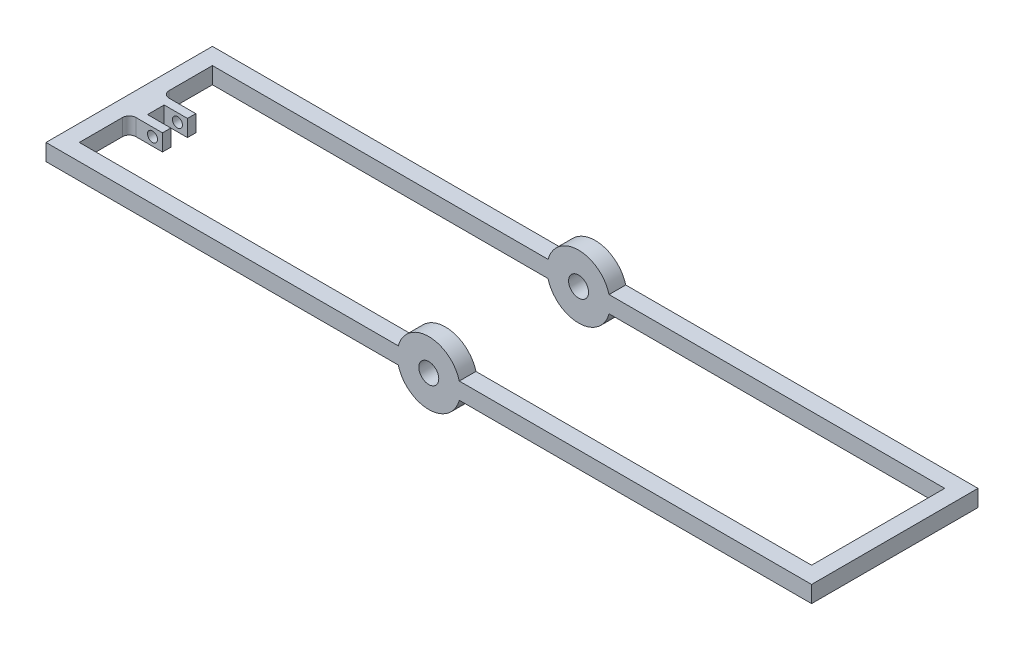
ISO-10303-21;
HEADER;
FILE_DESCRIPTION(('STEP AP214'),'2;1');
FILE_NAME('part.step','',(''),(''),'','','');
FILE_SCHEMA(('AUTOMOTIVE_DESIGN { 1 0 10303 214 1 1 1 1 }'));
ENDSEC;
DATA;
#1=APPLICATION_CONTEXT('core data for automotive mechanical design processes');
#2=APPLICATION_PROTOCOL_DEFINITION('international standard','automotive_design',2000,#1);
#3=PRODUCT_CONTEXT('',#1,'mechanical');
#4=PRODUCT('Part','Part','',(#3));
#5=PRODUCT_RELATED_PRODUCT_CATEGORY('part','',(#4));
#6=PRODUCT_DEFINITION_FORMATION('','',#4);
#7=PRODUCT_DEFINITION_CONTEXT('part definition',#1,'design');
#8=PRODUCT_DEFINITION('design','',#6,#7);
#9=PRODUCT_DEFINITION_SHAPE('','',#8);
#10=(LENGTH_UNIT() NAMED_UNIT(*) SI_UNIT(.MILLI.,.METRE.));
#11=(NAMED_UNIT(*) PLANE_ANGLE_UNIT() SI_UNIT($,.RADIAN.));
#12=(NAMED_UNIT(*) SI_UNIT($,.STERADIAN.) SOLID_ANGLE_UNIT());
#13=UNCERTAINTY_MEASURE_WITH_UNIT(LENGTH_MEASURE(1.E-05),#10,'distance_accuracy_value','');
#14=(GEOMETRIC_REPRESENTATION_CONTEXT(3) GLOBAL_UNCERTAINTY_ASSIGNED_CONTEXT((#13)) GLOBAL_UNIT_ASSIGNED_CONTEXT((#10,
#11,#12)) REPRESENTATION_CONTEXT('',''));
#15=CARTESIAN_POINT('',(0.,0.,0.));
#16=DIRECTION('',(0.,0.,1.));
#17=DIRECTION('',(1.,0.,0.));
#18=AXIS2_PLACEMENT_3D('',#15,#16,#17);
#19=CARTESIAN_POINT('',(15.,0.,0.));
#20=DIRECTION('',(-1.,0.,0.));
#21=DIRECTION('',(0.,0.,1.));
#22=AXIS2_PLACEMENT_3D('',#19,#20,#21);
#23=PLANE('',#22);
#24=DIRECTION('',(0.,0.,-1.));
#25=VECTOR('',#24,1.);
#26=CARTESIAN_POINT('',(15.,0.,20.));
#27=LINE('',#26,#25);
#28=CARTESIAN_POINT('',(15.,0.,30.));
#29=VERTEX_POINT('',#28);
#30=CARTESIAN_POINT('',(15.,0.,27.5));
#31=VERTEX_POINT('',#30);
#32=EDGE_CURVE('E552',#29,#31,#27,.T.);
#33=ORIENTED_EDGE('',*,*,#32,.T.);
#34=DIRECTION('',(0.,1.,0.));
#35=VECTOR('',#34,1.);
#36=CARTESIAN_POINT('',(15.,-7.001,27.5));
#37=LINE('',#36,#35);
#38=CARTESIAN_POINT('',(15.,5.,27.5));
#39=VERTEX_POINT('',#38);
#40=EDGE_CURVE('E561',#31,#39,#37,.T.);
#41=ORIENTED_EDGE('',*,*,#40,.T.);
#42=DIRECTION('',(0.,0.,1.));
#43=VECTOR('',#42,1.);
#44=CARTESIAN_POINT('',(15.,5.,20.));
#45=LINE('',#44,#43);
#46=CARTESIAN_POINT('',(15.,5.,30.));
#47=VERTEX_POINT('',#46);
#48=EDGE_CURVE('E243',#39,#47,#45,.T.);
#49=ORIENTED_EDGE('',*,*,#48,.T.);
#50=DIRECTION('',(0.,-1.,0.));
#51=VECTOR('',#50,1.);
#52=CARTESIAN_POINT('',(15.,5.,30.));
#53=LINE('',#52,#51);
#54=EDGE_CURVE('E553',#47,#29,#53,.T.);
#55=ORIENTED_EDGE('',*,*,#54,.T.);
#56=EDGE_LOOP('',(#33,#41,#49,#55));
#57=FACE_BOUND('',#56,.T.);
#58=ADVANCED_FACE('F40',(#57),#23,.F.);
#59=CARTESIAN_POINT('',(5.,12.,45.));
#60=DIRECTION('',(-1.,0.,0.));
#61=DIRECTION('',(0.,0.,1.));
#62=AXIS2_PLACEMENT_3D('',#59,#60,#61);
#63=PLANE('',#62);
#64=DIRECTION('',(0.,0.,1.));
#65=VECTOR('',#64,1.);
#66=CARTESIAN_POINT('',(5.,0.,50.));
#67=LINE('',#66,#65);
#68=CARTESIAN_POINT('',(5.,0.,32.));
#69=VERTEX_POINT('',#68);
#70=CARTESIAN_POINT('',(5.,0.,45.));
#71=VERTEX_POINT('',#70);
#72=EDGE_CURVE('E325',#69,#71,#67,.T.);
#73=ORIENTED_EDGE('',*,*,#72,.F.);
#74=DIRECTION('',(0.,-1.,0.));
#75=VECTOR('',#74,1.);
#76=CARTESIAN_POINT('',(5.,5.,32.));
#77=LINE('',#76,#75);
#78=CARTESIAN_POINT('',(5.,5.,32.));
#79=VERTEX_POINT('',#78);
#80=EDGE_CURVE('E450',#69,#79,#77,.F.);
#81=ORIENTED_EDGE('',*,*,#80,.T.);
#82=DIRECTION('',(0.,0.,-1.));
#83=VECTOR('',#82,1.);
#84=CARTESIAN_POINT('',(5.,5.,50.));
#85=LINE('',#84,#83);
#86=CARTESIAN_POINT('',(5.,5.,45.));
#87=VERTEX_POINT('',#86);
#88=EDGE_CURVE('E438',#87,#79,#85,.T.);
#89=ORIENTED_EDGE('',*,*,#88,.F.);
#90=DIRECTION('',(0.,-1.,0.));
#91=VECTOR('',#90,1.);
#92=CARTESIAN_POINT('',(5.,12.,45.));
#93=LINE('',#92,#91);
#94=EDGE_CURVE('E273',#87,#71,#93,.T.);
#95=ORIENTED_EDGE('',*,*,#94,.T.);
#96=EDGE_LOOP('',(#73,#81,#89,#95));
#97=FACE_BOUND('',#96,.T.);
#98=ADVANCED_FACE('F485',(#97),#63,.F.);
#99=CARTESIAN_POINT('',(5.,5.,18.));
#100=VERTEX_POINT('',#99);
#101=CARTESIAN_POINT('',(5.,5.,4.99999999999999));
#102=VERTEX_POINT('',#101);
#103=EDGE_CURVE('E431',#100,#102,#85,.T.);
#104=ORIENTED_EDGE('',*,*,#103,.F.);
#105=DIRECTION('',(0.,1.,0.));
#106=VECTOR('',#105,1.);
#107=CARTESIAN_POINT('',(5.,0.,18.));
#108=LINE('',#107,#106);
#109=CARTESIAN_POINT('',(5.,0.,18.));
#110=VERTEX_POINT('',#109);
#111=EDGE_CURVE('E63',#100,#110,#108,.F.);
#112=ORIENTED_EDGE('',*,*,#111,.T.);
#113=CARTESIAN_POINT('',(5.,0.,4.99999999999999));
#114=VERTEX_POINT('',#113);
#115=EDGE_CURVE('E326',#114,#110,#67,.T.);
#116=ORIENTED_EDGE('',*,*,#115,.F.);
#117=DIRECTION('',(0.,-1.,0.));
#118=VECTOR('',#117,1.);
#119=CARTESIAN_POINT('',(5.,12.,4.99999999999999));
#120=LINE('',#119,#118);
#121=EDGE_CURVE('E269',#102,#114,#120,.T.);
#122=ORIENTED_EDGE('',*,*,#121,.F.);
#123=EDGE_LOOP('',(#104,#112,#116,#122));
#124=FACE_BOUND('',#123,.T.);
#125=ADVANCED_FACE('F543',(#124),#63,.F.);
#126=CARTESIAN_POINT('',(115.,2.5,50.));
#127=DIRECTION('',(0.,0.,-1.));
#128=DIRECTION('',(-1.,0.,0.));
#129=AXIS2_PLACEMENT_3D('',#126,#127,#128);
#130=CYLINDRICAL_SURFACE('',#129,9.5);
#131=DIRECTION('',(0.,0.,-1.));
#132=VECTOR('',#131,1.);
#133=CARTESIAN_POINT('',(105.834848610088,0.,50.));
#134=LINE('',#133,#132);
#135=CARTESIAN_POINT('',(105.834848610088,0.,50.));
#136=VERTEX_POINT('',#135);
#137=CARTESIAN_POINT('',(105.834848610088,0.,45.));
#138=VERTEX_POINT('',#137);
#139=EDGE_CURVE('E423',#136,#138,#134,.T.);
#140=ORIENTED_EDGE('',*,*,#139,.T.);
#141=CARTESIAN_POINT('',(115.,2.5,45.));
#142=DIRECTION('',(0.,0.,1.));
#143=DIRECTION('',(1.,0.,0.));
#144=AXIS2_PLACEMENT_3D('',#141,#142,#143);
#145=CIRCLE('',#144,9.5);
#146=CARTESIAN_POINT('',(124.165151389912,0.,45.));
#147=VERTEX_POINT('',#146);
#148=EDGE_CURVE('E294',#138,#147,#145,.T.);
#149=ORIENTED_EDGE('',*,*,#148,.T.);
#150=DIRECTION('',(0.,0.,-1.));
#151=VECTOR('',#150,1.);
#152=CARTESIAN_POINT('',(124.165151389912,0.,50.));
#153=LINE('',#152,#151);
#154=CARTESIAN_POINT('',(124.165151389912,0.,50.));
#155=VERTEX_POINT('',#154);
#156=EDGE_CURVE('E418',#155,#147,#153,.T.);
#157=ORIENTED_EDGE('',*,*,#156,.F.);
#158=CARTESIAN_POINT('',(115.,2.5,50.));
#159=DIRECTION('',(0.,0.,1.));
#160=DIRECTION('',(1.,0.,0.));
#161=AXIS2_PLACEMENT_3D('',#158,#159,#160);
#162=CIRCLE('',#161,9.5);
#163=EDGE_CURVE('E350',#136,#155,#162,.T.);
#164=ORIENTED_EDGE('',*,*,#163,.F.);
#165=EDGE_LOOP('',(#140,#149,#157,#164));
#166=FACE_BOUND('',#165,.T.);
#167=ADVANCED_FACE('F533',(#166),#130,.T.);
#168=CARTESIAN_POINT('',(115.,2.5,50.));
#169=DIRECTION('',(0.,0.,-1.));
#170=DIRECTION('',(-1.,0.,0.));
#171=AXIS2_PLACEMENT_3D('',#168,#169,#170);
#172=CYLINDRICAL_SURFACE('',#171,9.5);
#173=CARTESIAN_POINT('',(115.,2.5,45.));
#174=DIRECTION('',(0.,0.,1.));
#175=DIRECTION('',(1.,0.,0.));
#176=AXIS2_PLACEMENT_3D('',#173,#174,#175);
#177=CIRCLE('',#176,9.5);
#178=CARTESIAN_POINT('',(124.165151389912,5.,45.));
#179=VERTEX_POINT('',#178);
#180=CARTESIAN_POINT('',(105.834848610088,5.,45.));
#181=VERTEX_POINT('',#180);
#182=EDGE_CURVE('E283',#179,#181,#177,.T.);
#183=ORIENTED_EDGE('',*,*,#182,.T.);
#184=DIRECTION('',(0.,0.,-1.));
#185=VECTOR('',#184,1.);
#186=CARTESIAN_POINT('',(105.834848610088,5.,50.));
#187=LINE('',#186,#185);
#188=CARTESIAN_POINT('',(105.834848610088,5.,50.));
#189=VERTEX_POINT('',#188);
#190=EDGE_CURVE('E400',#189,#181,#187,.T.);
#191=ORIENTED_EDGE('',*,*,#190,.F.);
#192=CARTESIAN_POINT('',(115.,2.5,50.));
#193=DIRECTION('',(0.,0.,1.));
#194=DIRECTION('',(1.,0.,0.));
#195=AXIS2_PLACEMENT_3D('',#192,#193,#194);
#196=CIRCLE('',#195,9.5);
#197=CARTESIAN_POINT('',(124.165151389912,5.,50.));
#198=VERTEX_POINT('',#197);
#199=EDGE_CURVE('E362',#198,#189,#196,.T.);
#200=ORIENTED_EDGE('',*,*,#199,.F.);
#201=DIRECTION('',(0.,0.,-1.));
#202=VECTOR('',#201,1.);
#203=CARTESIAN_POINT('',(124.165151389912,5.,50.));
#204=LINE('',#203,#202);
#205=EDGE_CURVE('E405',#198,#179,#204,.T.);
#206=ORIENTED_EDGE('',*,*,#205,.T.);
#207=EDGE_LOOP('',(#183,#191,#200,#206));
#208=FACE_BOUND('',#207,.T.);
#209=ADVANCED_FACE('F497',(#208),#172,.T.);
#210=CARTESIAN_POINT('',(115.,2.5,50.));
#211=DIRECTION('',(0.,0.,-1.));
#212=DIRECTION('',(-1.,0.,0.));
#213=AXIS2_PLACEMENT_3D('',#210,#211,#212);
#214=CYLINDRICAL_SURFACE('',#213,2.99999999999998);
#215=CARTESIAN_POINT('',(115.,2.5,5.00000000000001));
#216=DIRECTION('',(0.,0.,-1.));
#217=DIRECTION('',(-1.,0.,0.));
#218=AXIS2_PLACEMENT_3D('',#215,#216,#217);
#219=CIRCLE('',#218,2.99999999999998);
#220=CARTESIAN_POINT('',(112.,2.5,5.00000000000001));
#221=VERTEX_POINT('',#220);
#222=EDGE_CURVE('E301',#221,#221,#219,.T.);
#223=ORIENTED_EDGE('',*,*,#222,.F.);
#224=EDGE_LOOP('',(#223));
#225=FACE_BOUND('',#224,.T.);
#226=CARTESIAN_POINT('',(115.,2.5,0.));
#227=DIRECTION('',(0.,0.,1.));
#228=DIRECTION('',(1.,0.,0.));
#229=AXIS2_PLACEMENT_3D('',#226,#227,#228);
#230=CIRCLE('',#229,2.99999999999998);
#231=CARTESIAN_POINT('',(118.,2.5,0.));
#232=VERTEX_POINT('',#231);
#233=EDGE_CURVE('E333',#232,#232,#230,.T.);
#234=ORIENTED_EDGE('',*,*,#233,.F.);
#235=EDGE_LOOP('',(#234));
#236=FACE_BOUND('',#235,.T.);
#237=ADVANCED_FACE('F651',(#225,#236),#214,.F.);
#238=CARTESIAN_POINT('',(115.,2.5,50.));
#239=DIRECTION('',(0.,0.,1.));
#240=DIRECTION('',(1.,0.,0.));
#241=AXIS2_PLACEMENT_3D('',#238,#239,#240);
#242=PLANE('',#241);
#243=DIRECTION('',(0.,-1.,0.));
#244=VECTOR('',#243,1.);
#245=CARTESIAN_POINT('',(0.,0.,50.));
#246=LINE('',#245,#244);
#247=CARTESIAN_POINT('',(0.,5.,50.));
#248=VERTEX_POINT('',#247);
#249=CARTESIAN_POINT('',(0.,0.,50.));
#250=VERTEX_POINT('',#249);
#251=EDGE_CURVE('E342',#248,#250,#246,.T.);
#252=ORIENTED_EDGE('',*,*,#251,.T.);
#253=DIRECTION('',(1.,0.,0.));
#254=VECTOR('',#253,1.);
#255=CARTESIAN_POINT('',(0.,0.,50.));
#256=LINE('',#255,#254);
#257=EDGE_CURVE('E346',#250,#136,#256,.T.);
#258=ORIENTED_EDGE('',*,*,#257,.T.);
#259=ORIENTED_EDGE('',*,*,#163,.T.);
#260=DIRECTION('',(1.,0.,0.));
#261=VECTOR('',#260,1.);
#262=CARTESIAN_POINT('',(124.165151389912,0.,50.));
#263=LINE('',#262,#261);
#264=CARTESIAN_POINT('',(230.,0.,50.));
#265=VERTEX_POINT('',#264);
#266=EDGE_CURVE('E353',#155,#265,#263,.T.);
#267=ORIENTED_EDGE('',*,*,#266,.T.);
#268=DIRECTION('',(0.,1.,0.));
#269=VECTOR('',#268,1.);
#270=CARTESIAN_POINT('',(230.,0.,50.));
#271=LINE('',#270,#269);
#272=CARTESIAN_POINT('',(230.,5.,50.));
#273=VERTEX_POINT('',#272);
#274=EDGE_CURVE('E356',#265,#273,#271,.T.);
#275=ORIENTED_EDGE('',*,*,#274,.T.);
#276=DIRECTION('',(-1.,0.,0.));
#277=VECTOR('',#276,1.);
#278=CARTESIAN_POINT('',(124.165151389912,5.,50.));
#279=LINE('',#278,#277);
#280=EDGE_CURVE('E359',#273,#198,#279,.T.);
#281=ORIENTED_EDGE('',*,*,#280,.T.);
#282=ORIENTED_EDGE('',*,*,#199,.T.);
#283=DIRECTION('',(-1.,0.,0.));
#284=VECTOR('',#283,1.);
#285=CARTESIAN_POINT('',(0.,5.,50.));
#286=LINE('',#285,#284);
#287=EDGE_CURVE('E365',#189,#248,#286,.T.);
#288=ORIENTED_EDGE('',*,*,#287,.T.);
#289=EDGE_LOOP('',(#252,#258,#259,#267,#275,#281,#282,#288));
#290=FACE_BOUND('',#289,.T.);
#291=CARTESIAN_POINT('',(115.,2.5,50.));
#292=DIRECTION('',(0.,0.,1.));
#293=DIRECTION('',(1.,0.,0.));
#294=AXIS2_PLACEMENT_3D('',#291,#292,#293);
#295=CIRCLE('',#294,2.99999999999998);
#296=CARTESIAN_POINT('',(118.,2.5,50.));
#297=VERTEX_POINT('',#296);
#298=EDGE_CURVE('E334',#297,#297,#295,.T.);
#299=ORIENTED_EDGE('',*,*,#298,.F.);
#300=EDGE_LOOP('',(#299));
#301=FACE_BOUND('',#300,.T.);
#302=ADVANCED_FACE('F499',(#290,#301),#242,.T.);
#303=CARTESIAN_POINT('',(115.,2.5,0.));
#304=DIRECTION('',(0.,0.,1.));
#305=DIRECTION('',(1.,0.,0.));
#306=AXIS2_PLACEMENT_3D('',#303,#304,#305);
#307=PLANE('',#306);
#308=DIRECTION('',(0.,-1.,0.));
#309=VECTOR('',#308,1.);
#310=CARTESIAN_POINT('',(0.,0.,0.));
#311=LINE('',#310,#309);
#312=CARTESIAN_POINT('',(0.,5.,0.));
#313=VERTEX_POINT('',#312);
#314=CARTESIAN_POINT('',(0.,0.,0.));
#315=VERTEX_POINT('',#314);
#316=EDGE_CURVE('E338',#313,#315,#311,.T.);
#317=ORIENTED_EDGE('',*,*,#316,.F.);
#318=DIRECTION('',(-1.,0.,0.));
#319=VECTOR('',#318,1.);
#320=CARTESIAN_POINT('',(0.,5.,0.));
#321=LINE('',#320,#319);
#322=CARTESIAN_POINT('',(105.834848610088,5.,0.));
#323=VERTEX_POINT('',#322);
#324=EDGE_CURVE('E347',#323,#313,#321,.T.);
#325=ORIENTED_EDGE('',*,*,#324,.F.);
#326=CARTESIAN_POINT('',(115.,2.5,0.));
#327=DIRECTION('',(0.,0.,1.));
#328=DIRECTION('',(1.,0.,0.));
#329=AXIS2_PLACEMENT_3D('',#326,#327,#328);
#330=CIRCLE('',#329,9.5);
#331=CARTESIAN_POINT('',(124.165151389912,5.,0.));
#332=VERTEX_POINT('',#331);
#333=EDGE_CURVE('E390',#332,#323,#330,.T.);
#334=ORIENTED_EDGE('',*,*,#333,.F.);
#335=DIRECTION('',(-1.,0.,0.));
#336=VECTOR('',#335,1.);
#337=CARTESIAN_POINT('',(124.165151389912,5.,0.));
#338=LINE('',#337,#336);
#339=CARTESIAN_POINT('',(230.,5.,0.));
#340=VERTEX_POINT('',#339);
#341=EDGE_CURVE('E386',#340,#332,#338,.T.);
#342=ORIENTED_EDGE('',*,*,#341,.F.);
#343=DIRECTION('',(0.,1.,0.));
#344=VECTOR('',#343,1.);
#345=CARTESIAN_POINT('',(230.,0.,0.));
#346=LINE('',#345,#344);
#347=CARTESIAN_POINT('',(230.,0.,0.));
#348=VERTEX_POINT('',#347);
#349=EDGE_CURVE('E383',#348,#340,#346,.T.);
#350=ORIENTED_EDGE('',*,*,#349,.F.);
#351=DIRECTION('',(1.,0.,0.));
#352=VECTOR('',#351,1.);
#353=CARTESIAN_POINT('',(124.165151389912,0.,0.));
#354=LINE('',#353,#352);
#355=CARTESIAN_POINT('',(124.165151389912,0.,0.));
#356=VERTEX_POINT('',#355);
#357=EDGE_CURVE('E380',#356,#348,#354,.T.);
#358=ORIENTED_EDGE('',*,*,#357,.F.);
#359=CARTESIAN_POINT('',(115.,2.5,0.));
#360=DIRECTION('',(0.,0.,1.));
#361=DIRECTION('',(1.,0.,0.));
#362=AXIS2_PLACEMENT_3D('',#359,#360,#361);
#363=CIRCLE('',#362,9.5);
#364=CARTESIAN_POINT('',(105.834848610088,0.,0.));
#365=VERTEX_POINT('',#364);
#366=EDGE_CURVE('E376',#365,#356,#363,.T.);
#367=ORIENTED_EDGE('',*,*,#366,.F.);
#368=DIRECTION('',(1.,0.,0.));
#369=VECTOR('',#368,1.);
#370=CARTESIAN_POINT('',(0.,0.,0.));
#371=LINE('',#370,#369);
#372=EDGE_CURVE('E372',#315,#365,#371,.T.);
#373=ORIENTED_EDGE('',*,*,#372,.F.);
#374=EDGE_LOOP('',(#317,#325,#334,#342,#350,#358,#367,#373));
#375=FACE_BOUND('',#374,.T.);
#376=ORIENTED_EDGE('',*,*,#233,.T.);
#377=EDGE_LOOP('',(#376));
#378=FACE_BOUND('',#377,.T.);
#379=ADVANCED_FACE('F510',(#375,#378),#307,.F.);
#380=CARTESIAN_POINT('',(0.,0.,50.));
#381=DIRECTION('',(1.,0.,0.));
#382=DIRECTION('',(0.,0.,-1.));
#383=AXIS2_PLACEMENT_3D('',#380,#381,#382);
#384=PLANE('',#383);
#385=ORIENTED_EDGE('',*,*,#316,.T.);
#386=DIRECTION('',(0.,0.,-1.));
#387=VECTOR('',#386,1.);
#388=CARTESIAN_POINT('',(0.,0.,50.));
#389=LINE('',#388,#387);
#390=EDGE_CURVE('E427',#250,#315,#389,.T.);
#391=ORIENTED_EDGE('',*,*,#390,.F.);
#392=ORIENTED_EDGE('',*,*,#251,.F.);
#393=DIRECTION('',(0.,0.,-1.));
#394=VECTOR('',#393,1.);
#395=CARTESIAN_POINT('',(0.,5.,50.));
#396=LINE('',#395,#394);
#397=EDGE_CURVE('E368',#248,#313,#396,.T.);
#398=ORIENTED_EDGE('',*,*,#397,.T.);
#399=EDGE_LOOP('',(#385,#391,#392,#398));
#400=FACE_BOUND('',#399,.T.);
#401=ADVANCED_FACE('F537',(#400),#384,.F.);
#402=CARTESIAN_POINT('',(0.,0.,50.));
#403=DIRECTION('',(0.,1.,0.));
#404=DIRECTION('',(0.,0.,1.));
#405=AXIS2_PLACEMENT_3D('',#402,#403,#404);
#406=PLANE('',#405);
#407=DIRECTION('',(0.,0.,-1.));
#408=VECTOR('',#407,1.);
#409=CARTESIAN_POINT('',(8.,0.,27.5));
#410=LINE('',#409,#408);
#411=CARTESIAN_POINT('',(8.,0.,27.5));
#412=VERTEX_POINT('',#411);
#413=CARTESIAN_POINT('',(8.,0.,22.5));
#414=VERTEX_POINT('',#413);
#415=EDGE_CURVE('E578',#412,#414,#410,.T.);
#416=ORIENTED_EDGE('',*,*,#415,.F.);
#417=DIRECTION('',(-1.,0.,0.));
#418=VECTOR('',#417,1.);
#419=CARTESIAN_POINT('',(8.,0.,27.5));
#420=LINE('',#419,#418);
#421=EDGE_CURVE('E235',#31,#412,#420,.T.);
#422=ORIENTED_EDGE('',*,*,#421,.F.);
#423=ORIENTED_EDGE('',*,*,#32,.F.);
#424=DIRECTION('',(-1.,0.,0.));
#425=VECTOR('',#424,1.);
#426=CARTESIAN_POINT('',(15.,0.,30.));
#427=LINE('',#426,#425);
#428=CARTESIAN_POINT('',(7.,0.,30.));
#429=VERTEX_POINT('',#428);
#430=EDGE_CURVE('E259',#29,#429,#427,.T.);
#431=ORIENTED_EDGE('',*,*,#430,.T.);
#432=CARTESIAN_POINT('',(7.,0.,32.));
#433=DIRECTION('',(0.,1.,0.));
#434=DIRECTION('',(0.,0.,1.));
#435=AXIS2_PLACEMENT_3D('',#432,#433,#434);
#436=CIRCLE('',#435,2.);
#437=EDGE_CURVE('E459',#429,#69,#436,.T.);
#438=ORIENTED_EDGE('',*,*,#437,.T.);
#439=ORIENTED_EDGE('',*,*,#72,.T.);
#440=DIRECTION('',(1.,0.,0.));
#441=VECTOR('',#440,1.);
#442=CARTESIAN_POINT('',(0.,0.,45.));
#443=LINE('',#442,#441);
#444=EDGE_CURVE('E297',#71,#138,#443,.T.);
#445=ORIENTED_EDGE('',*,*,#444,.T.);
#446=ORIENTED_EDGE('',*,*,#139,.F.);
#447=ORIENTED_EDGE('',*,*,#257,.F.);
#448=ORIENTED_EDGE('',*,*,#390,.T.);
#449=ORIENTED_EDGE('',*,*,#372,.T.);
#450=CARTESIAN_POINT('',(105.834848610088,0.,5.00000000000001));
#451=VERTEX_POINT('',#450);
#452=EDGE_CURVE('E422',#451,#365,#134,.T.);
#453=ORIENTED_EDGE('',*,*,#452,.F.);
#454=DIRECTION('',(-1.,0.,0.));
#455=VECTOR('',#454,1.);
#456=CARTESIAN_POINT('',(0.,0.,5.));
#457=LINE('',#456,#455);
#458=EDGE_CURVE('E321',#451,#114,#457,.T.);
#459=ORIENTED_EDGE('',*,*,#458,.T.);
#460=ORIENTED_EDGE('',*,*,#115,.T.);
#461=CARTESIAN_POINT('',(7.,0.,18.));
#462=DIRECTION('',(0.,1.,0.));
#463=DIRECTION('',(0.,0.,1.));
#464=AXIS2_PLACEMENT_3D('',#461,#462,#463);
#465=CIRCLE('',#464,2.);
#466=CARTESIAN_POINT('',(7.,0.,20.));
#467=VERTEX_POINT('',#466);
#468=EDGE_CURVE('E12',#110,#467,#465,.T.);
#469=ORIENTED_EDGE('',*,*,#468,.T.);
#470=DIRECTION('',(-1.,0.,0.));
#471=VECTOR('',#470,1.);
#472=CARTESIAN_POINT('',(15.,0.,20.));
#473=LINE('',#472,#471);
#474=CARTESIAN_POINT('',(15.,0.,20.));
#475=VERTEX_POINT('',#474);
#476=EDGE_CURVE('E255',#475,#467,#473,.T.);
#477=ORIENTED_EDGE('',*,*,#476,.F.);
#478=CARTESIAN_POINT('',(15.,0.,22.5));
#479=VERTEX_POINT('',#478);
#480=EDGE_CURVE('E550',#479,#475,#27,.T.);
#481=ORIENTED_EDGE('',*,*,#480,.F.);
#482=DIRECTION('',(1.,0.,0.));
#483=VECTOR('',#482,1.);
#484=CARTESIAN_POINT('',(8.,0.,22.5));
#485=LINE('',#484,#483);
#486=EDGE_CURVE('E219',#414,#479,#485,.T.);
#487=ORIENTED_EDGE('',*,*,#486,.F.);
#488=EDGE_LOOP('',(#416,#422,#423,#431,#438,#439,#445,#446,#447,#448,#449,#453,#459,#460,#469,
#477,#481,#487));
#489=FACE_BOUND('',#488,.T.);
#490=ADVANCED_FACE('F476',(#489),#406,.F.);
#491=CARTESIAN_POINT('',(124.165151389912,0.,5.00000000000001));
#492=VERTEX_POINT('',#491);
#493=EDGE_CURVE('E417',#492,#356,#153,.T.);
#494=ORIENTED_EDGE('',*,*,#493,.F.);
#495=CARTESIAN_POINT('',(115.,2.5,5.00000000000001));
#496=DIRECTION('',(0.,0.,-1.));
#497=DIRECTION('',(-1.,0.,0.));
#498=AXIS2_PLACEMENT_3D('',#495,#496,#497);
#499=CIRCLE('',#498,9.5);
#500=EDGE_CURVE('E317',#492,#451,#499,.T.);
#501=ORIENTED_EDGE('',*,*,#500,.T.);
#502=ORIENTED_EDGE('',*,*,#452,.T.);
#503=ORIENTED_EDGE('',*,*,#366,.T.);
#504=EDGE_LOOP('',(#494,#501,#502,#503));
#505=FACE_BOUND('',#504,.T.);
#506=ADVANCED_FACE('F541',(#505),#130,.T.);
#507=CARTESIAN_POINT('',(124.165151389912,0.,50.));
#508=DIRECTION('',(0.,1.,0.));
#509=DIRECTION('',(0.,0.,1.));
#510=AXIS2_PLACEMENT_3D('',#507,#508,#509);
#511=PLANE('',#510);
#512=DIRECTION('',(0.,0.,-1.));
#513=VECTOR('',#512,1.);
#514=CARTESIAN_POINT('',(225.,0.,50.));
#515=LINE('',#514,#513);
#516=CARTESIAN_POINT('',(225.,0.,45.));
#517=VERTEX_POINT('',#516);
#518=CARTESIAN_POINT('',(225.,0.,5.00000000000002));
#519=VERTEX_POINT('',#518);
#520=EDGE_CURVE('E329',#517,#519,#515,.T.);
#521=ORIENTED_EDGE('',*,*,#520,.T.);
#522=DIRECTION('',(-1.,0.,0.));
#523=VECTOR('',#522,1.);
#524=CARTESIAN_POINT('',(124.165151389912,0.,5.00000000000001));
#525=LINE('',#524,#523);
#526=EDGE_CURVE('E313',#519,#492,#525,.T.);
#527=ORIENTED_EDGE('',*,*,#526,.T.);
#528=ORIENTED_EDGE('',*,*,#493,.T.);
#529=ORIENTED_EDGE('',*,*,#357,.T.);
#530=DIRECTION('',(0.,0.,-1.));
#531=VECTOR('',#530,1.);
#532=CARTESIAN_POINT('',(230.,0.,50.));
#533=LINE('',#532,#531);
#534=EDGE_CURVE('E413',#265,#348,#533,.T.);
#535=ORIENTED_EDGE('',*,*,#534,.F.);
#536=ORIENTED_EDGE('',*,*,#266,.F.);
#537=ORIENTED_EDGE('',*,*,#156,.T.);
#538=DIRECTION('',(1.,0.,0.));
#539=VECTOR('',#538,1.);
#540=CARTESIAN_POINT('',(124.165151389912,0.,45.));
#541=LINE('',#540,#539);
#542=EDGE_CURVE('E290',#147,#517,#541,.T.);
#543=ORIENTED_EDGE('',*,*,#542,.T.);
#544=EDGE_LOOP('',(#521,#527,#528,#529,#535,#536,#537,#543));
#545=FACE_BOUND('',#544,.T.);
#546=ADVANCED_FACE('F526',(#545),#511,.F.);
#547=CARTESIAN_POINT('',(230.,0.,50.));
#548=DIRECTION('',(-1.,0.,0.));
#549=DIRECTION('',(0.,0.,1.));
#550=AXIS2_PLACEMENT_3D('',#547,#548,#549);
#551=PLANE('',#550);
#552=ORIENTED_EDGE('',*,*,#349,.T.);
#553=DIRECTION('',(0.,0.,-1.));
#554=VECTOR('',#553,1.);
#555=CARTESIAN_POINT('',(230.,5.,50.));
#556=LINE('',#555,#554);
#557=EDGE_CURVE('E409',#273,#340,#556,.T.);
#558=ORIENTED_EDGE('',*,*,#557,.F.);
#559=ORIENTED_EDGE('',*,*,#274,.F.);
#560=ORIENTED_EDGE('',*,*,#534,.T.);
#561=EDGE_LOOP('',(#552,#558,#559,#560));
#562=FACE_BOUND('',#561,.T.);
#563=ADVANCED_FACE('F662',(#562),#551,.F.);
#564=CARTESIAN_POINT('',(124.165151389912,5.,50.));
#565=DIRECTION('',(0.,-1.,0.));
#566=DIRECTION('',(0.,0.,-1.));
#567=AXIS2_PLACEMENT_3D('',#564,#565,#566);
#568=PLANE('',#567);
#569=CARTESIAN_POINT('',(124.165151389912,5.,5.00000000000001));
#570=VERTEX_POINT('',#569);
#571=EDGE_CURVE('E404',#570,#332,#204,.T.);
#572=ORIENTED_EDGE('',*,*,#571,.F.);
#573=DIRECTION('',(1.,0.,0.));
#574=VECTOR('',#573,1.);
#575=CARTESIAN_POINT('',(124.165151389912,5.,5.00000000000001));
#576=LINE('',#575,#574);
#577=CARTESIAN_POINT('',(225.,5.,5.00000000000002));
#578=VERTEX_POINT('',#577);
#579=EDGE_CURVE('E309',#570,#578,#576,.T.);
#580=ORIENTED_EDGE('',*,*,#579,.T.);
#581=DIRECTION('',(0.,0.,1.));
#582=VECTOR('',#581,1.);
#583=CARTESIAN_POINT('',(225.,5.,50.));
#584=LINE('',#583,#582);
#585=CARTESIAN_POINT('',(225.,5.,45.));
#586=VERTEX_POINT('',#585);
#587=EDGE_CURVE('E442',#578,#586,#584,.T.);
#588=ORIENTED_EDGE('',*,*,#587,.T.);
#589=DIRECTION('',(-1.,0.,0.));
#590=VECTOR('',#589,1.);
#591=CARTESIAN_POINT('',(124.165151389912,5.,45.));
#592=LINE('',#591,#590);
#593=EDGE_CURVE('E286',#586,#179,#592,.T.);
#594=ORIENTED_EDGE('',*,*,#593,.T.);
#595=ORIENTED_EDGE('',*,*,#205,.F.);
#596=ORIENTED_EDGE('',*,*,#280,.F.);
#597=ORIENTED_EDGE('',*,*,#557,.T.);
#598=ORIENTED_EDGE('',*,*,#341,.T.);
#599=EDGE_LOOP('',(#572,#580,#588,#594,#595,#596,#597,#598));
#600=FACE_BOUND('',#599,.T.);
#601=ADVANCED_FACE('F494',(#600),#568,.F.);
#602=CARTESIAN_POINT('',(115.,2.5,5.00000000000001));
#603=DIRECTION('',(0.,0.,-1.));
#604=DIRECTION('',(-1.,0.,0.));
#605=AXIS2_PLACEMENT_3D('',#602,#603,#604);
#606=CIRCLE('',#605,9.5);
#607=CARTESIAN_POINT('',(105.834848610088,5.,5.00000000000001));
#608=VERTEX_POINT('',#607);
#609=EDGE_CURVE('E306',#608,#570,#606,.T.);
#610=ORIENTED_EDGE('',*,*,#609,.T.);
#611=ORIENTED_EDGE('',*,*,#571,.T.);
#612=ORIENTED_EDGE('',*,*,#333,.T.);
#613=EDGE_CURVE('E399',#608,#323,#187,.T.);
#614=ORIENTED_EDGE('',*,*,#613,.F.);
#615=EDGE_LOOP('',(#610,#611,#612,#614));
#616=FACE_BOUND('',#615,.T.);
#617=ADVANCED_FACE('F516',(#616),#172,.T.);
#618=CARTESIAN_POINT('',(0.,5.,50.));
#619=DIRECTION('',(0.,-1.,0.));
#620=DIRECTION('',(0.,0.,-1.));
#621=AXIS2_PLACEMENT_3D('',#618,#619,#620);
#622=PLANE('',#621);
#623=ORIENTED_EDGE('',*,*,#48,.F.);
#624=DIRECTION('',(1.,0.,0.));
#625=VECTOR('',#624,1.);
#626=CARTESIAN_POINT('',(8.,5.,27.5));
#627=LINE('',#626,#625);
#628=CARTESIAN_POINT('',(8.,5.,27.5));
#629=VERTEX_POINT('',#628);
#630=EDGE_CURVE('E225',#629,#39,#627,.T.);
#631=ORIENTED_EDGE('',*,*,#630,.F.);
#632=DIRECTION('',(0.,0.,1.));
#633=VECTOR('',#632,1.);
#634=CARTESIAN_POINT('',(8.,5.,27.5));
#635=LINE('',#634,#633);
#636=CARTESIAN_POINT('',(8.,5.,22.5));
#637=VERTEX_POINT('',#636);
#638=EDGE_CURVE('E233',#637,#629,#635,.T.);
#639=ORIENTED_EDGE('',*,*,#638,.F.);
#640=DIRECTION('',(-1.,0.,0.));
#641=VECTOR('',#640,1.);
#642=CARTESIAN_POINT('',(8.,5.,22.5));
#643=LINE('',#642,#641);
#644=CARTESIAN_POINT('',(15.,5.,22.5));
#645=VERTEX_POINT('',#644);
#646=EDGE_CURVE('E216',#645,#637,#643,.T.);
#647=ORIENTED_EDGE('',*,*,#646,.F.);
#648=CARTESIAN_POINT('',(15.,5.,20.));
#649=VERTEX_POINT('',#648);
#650=EDGE_CURVE('E230',#649,#645,#45,.T.);
#651=ORIENTED_EDGE('',*,*,#650,.F.);
#652=DIRECTION('',(-1.,0.,0.));
#653=VECTOR('',#652,1.);
#654=CARTESIAN_POINT('',(15.,5.,20.));
#655=LINE('',#654,#653);
#656=CARTESIAN_POINT('',(7.,5.,20.));
#657=VERTEX_POINT('',#656);
#658=EDGE_CURVE('E248',#649,#657,#655,.T.);
#659=ORIENTED_EDGE('',*,*,#658,.T.);
#660=CARTESIAN_POINT('',(7.,5.,18.));
#661=DIRECTION('',(0.,-1.,0.));
#662=DIRECTION('',(0.,0.,-1.));
#663=AXIS2_PLACEMENT_3D('',#660,#661,#662);
#664=CIRCLE('',#663,2.);
#665=EDGE_CURVE('E50',#657,#100,#664,.T.);
#666=ORIENTED_EDGE('',*,*,#665,.T.);
#667=ORIENTED_EDGE('',*,*,#103,.T.);
#668=DIRECTION('',(1.,0.,0.));
#669=VECTOR('',#668,1.);
#670=CARTESIAN_POINT('',(0.,5.,5.));
#671=LINE('',#670,#669);
#672=EDGE_CURVE('E302',#102,#608,#671,.T.);
#673=ORIENTED_EDGE('',*,*,#672,.T.);
#674=ORIENTED_EDGE('',*,*,#613,.T.);
#675=ORIENTED_EDGE('',*,*,#324,.T.);
#676=ORIENTED_EDGE('',*,*,#397,.F.);
#677=ORIENTED_EDGE('',*,*,#287,.F.);
#678=ORIENTED_EDGE('',*,*,#190,.T.);
#679=DIRECTION('',(-1.,0.,0.));
#680=VECTOR('',#679,1.);
#681=CARTESIAN_POINT('',(0.,5.,45.));
#682=LINE('',#681,#680);
#683=EDGE_CURVE('E279',#181,#87,#682,.T.);
#684=ORIENTED_EDGE('',*,*,#683,.T.);
#685=ORIENTED_EDGE('',*,*,#88,.T.);
#686=CARTESIAN_POINT('',(7.,5.,32.));
#687=DIRECTION('',(0.,-1.,0.));
#688=DIRECTION('',(0.,0.,-1.));
#689=AXIS2_PLACEMENT_3D('',#686,#687,#688);
#690=CIRCLE('',#689,2.);
#691=CARTESIAN_POINT('',(7.,5.,30.));
#692=VERTEX_POINT('',#691);
#693=EDGE_CURVE('E462',#79,#692,#690,.T.);
#694=ORIENTED_EDGE('',*,*,#693,.T.);
#695=DIRECTION('',(-1.,0.,0.));
#696=VECTOR('',#695,1.);
#697=CARTESIAN_POINT('',(15.,5.,30.));
#698=LINE('',#697,#696);
#699=EDGE_CURVE('E242',#47,#692,#698,.T.);
#700=ORIENTED_EDGE('',*,*,#699,.F.);
#701=EDGE_LOOP('',(#623,#631,#639,#647,#651,#659,#666,#667,#673,#674,#675,#676,#677,#678,#684,
#685,#694,#700));
#702=FACE_BOUND('',#701,.T.);
#703=ADVANCED_FACE('F229',(#702),#622,.F.);
#704=CARTESIAN_POINT('',(115.,2.5,45.));
#705=DIRECTION('',(0.,0.,1.));
#706=DIRECTION('',(1.,0.,0.));
#707=AXIS2_PLACEMENT_3D('',#704,#705,#706);
#708=CIRCLE('',#707,2.99999999999998);
#709=CARTESIAN_POINT('',(118.,2.5,45.));
#710=VERTEX_POINT('',#709);
#711=EDGE_CURVE('E268',#710,#710,#708,.T.);
#712=ORIENTED_EDGE('',*,*,#711,.F.);
#713=EDGE_LOOP('',(#712));
#714=FACE_BOUND('',#713,.T.);
#715=ORIENTED_EDGE('',*,*,#298,.T.);
#716=EDGE_LOOP('',(#715));
#717=FACE_BOUND('',#716,.T.);
#718=ADVANCED_FACE('F647',(#714,#717),#214,.F.);
#719=CARTESIAN_POINT('',(225.,12.,45.));
#720=DIRECTION('',(1.,0.,0.));
#721=DIRECTION('',(0.,0.,-1.));
#722=AXIS2_PLACEMENT_3D('',#719,#720,#721);
#723=PLANE('',#722);
#724=DIRECTION('',(0.,-1.,0.));
#725=VECTOR('',#724,1.);
#726=CARTESIAN_POINT('',(225.,12.,45.));
#727=LINE('',#726,#725);
#728=EDGE_CURVE('E263',#586,#517,#727,.T.);
#729=ORIENTED_EDGE('',*,*,#728,.F.);
#730=ORIENTED_EDGE('',*,*,#587,.F.);
#731=DIRECTION('',(0.,-1.,0.));
#732=VECTOR('',#731,1.);
#733=CARTESIAN_POINT('',(225.,12.,5.00000000000002));
#734=LINE('',#733,#732);
#735=EDGE_CURVE('E264',#578,#519,#734,.T.);
#736=ORIENTED_EDGE('',*,*,#735,.T.);
#737=ORIENTED_EDGE('',*,*,#520,.F.);
#738=EDGE_LOOP('',(#729,#730,#736,#737));
#739=FACE_BOUND('',#738,.T.);
#740=ADVANCED_FACE('F524',(#739),#723,.F.);
#741=CARTESIAN_POINT('',(5.,12.,4.99999999999999));
#742=DIRECTION('',(0.,0.,-1.));
#743=DIRECTION('',(-1.,0.,0.));
#744=AXIS2_PLACEMENT_3D('',#741,#742,#743);
#745=PLANE('',#744);
#746=ORIENTED_EDGE('',*,*,#222,.T.);
#747=EDGE_LOOP('',(#746));
#748=FACE_BOUND('',#747,.T.);
#749=ORIENTED_EDGE('',*,*,#500,.F.);
#750=ORIENTED_EDGE('',*,*,#526,.F.);
#751=ORIENTED_EDGE('',*,*,#735,.F.);
#752=ORIENTED_EDGE('',*,*,#579,.F.);
#753=ORIENTED_EDGE('',*,*,#609,.F.);
#754=ORIENTED_EDGE('',*,*,#672,.F.);
#755=ORIENTED_EDGE('',*,*,#121,.T.);
#756=ORIENTED_EDGE('',*,*,#458,.F.);
#757=EDGE_LOOP('',(#749,#750,#751,#752,#753,#754,#755,#756));
#758=FACE_BOUND('',#757,.T.);
#759=ADVANCED_FACE('F520',(#748,#758),#745,.F.);
#760=CARTESIAN_POINT('',(5.,12.,45.));
#761=DIRECTION('',(0.,0.,1.));
#762=DIRECTION('',(1.,0.,0.));
#763=AXIS2_PLACEMENT_3D('',#760,#761,#762);
#764=PLANE('',#763);
#765=ORIENTED_EDGE('',*,*,#711,.T.);
#766=EDGE_LOOP('',(#765));
#767=FACE_BOUND('',#766,.T.);
#768=ORIENTED_EDGE('',*,*,#94,.F.);
#769=ORIENTED_EDGE('',*,*,#683,.F.);
#770=ORIENTED_EDGE('',*,*,#182,.F.);
#771=ORIENTED_EDGE('',*,*,#593,.F.);
#772=ORIENTED_EDGE('',*,*,#728,.T.);
#773=ORIENTED_EDGE('',*,*,#542,.F.);
#774=ORIENTED_EDGE('',*,*,#148,.F.);
#775=ORIENTED_EDGE('',*,*,#444,.F.);
#776=EDGE_LOOP('',(#768,#769,#770,#771,#772,#773,#774,#775));
#777=FACE_BOUND('',#776,.T.);
#778=ADVANCED_FACE('F481',(#767,#777),#764,.F.);
#779=CARTESIAN_POINT('',(15.,5.,30.));
#780=DIRECTION('',(0.,0.,-1.));
#781=DIRECTION('',(-1.,0.,0.));
#782=AXIS2_PLACEMENT_3D('',#779,#780,#781);
#783=PLANE('',#782);
#784=CARTESIAN_POINT('',(12.,2.5,30.));
#785=DIRECTION('',(0.,0.,-1.));
#786=DIRECTION('',(-1.,0.,0.));
#787=AXIS2_PLACEMENT_3D('',#784,#785,#786);
#788=CIRCLE('',#787,1.5);
#789=CARTESIAN_POINT('',(10.5,2.5,30.));
#790=VERTEX_POINT('',#789);
#791=EDGE_CURVE('E590',#790,#790,#788,.T.);
#792=ORIENTED_EDGE('',*,*,#791,.T.);
#793=EDGE_LOOP('',(#792));
#794=FACE_BOUND('',#793,.T.);
#795=ORIENTED_EDGE('',*,*,#699,.T.);
#796=DIRECTION('',(0.,-1.,0.));
#797=VECTOR('',#796,1.);
#798=CARTESIAN_POINT('',(7.,0.,30.));
#799=LINE('',#798,#797);
#800=EDGE_CURVE('E446',#692,#429,#799,.T.);
#801=ORIENTED_EDGE('',*,*,#800,.T.);
#802=ORIENTED_EDGE('',*,*,#430,.F.);
#803=ORIENTED_EDGE('',*,*,#54,.F.);
#804=EDGE_LOOP('',(#795,#801,#802,#803));
#805=FACE_BOUND('',#804,.T.);
#806=ADVANCED_FACE('F631',(#794,#805),#783,.F.);
#807=CARTESIAN_POINT('',(15.,5.,20.));
#808=DIRECTION('',(0.,0.,1.));
#809=DIRECTION('',(1.,0.,0.));
#810=AXIS2_PLACEMENT_3D('',#807,#808,#809);
#811=PLANE('',#810);
#812=CARTESIAN_POINT('',(12.,2.5,20.));
#813=DIRECTION('',(0.,0.,-1.));
#814=DIRECTION('',(-1.,0.,0.));
#815=AXIS2_PLACEMENT_3D('',#812,#813,#814);
#816=CIRCLE('',#815,1.5);
#817=CARTESIAN_POINT('',(10.5,2.5,20.));
#818=VERTEX_POINT('',#817);
#819=EDGE_CURVE('E586',#818,#818,#816,.T.);
#820=ORIENTED_EDGE('',*,*,#819,.F.);
#821=EDGE_LOOP('',(#820));
#822=FACE_BOUND('',#821,.T.);
#823=ORIENTED_EDGE('',*,*,#476,.T.);
#824=DIRECTION('',(0.,1.,0.));
#825=VECTOR('',#824,1.);
#826=CARTESIAN_POINT('',(7.,5.,20.));
#827=LINE('',#826,#825);
#828=EDGE_CURVE('E453',#467,#657,#827,.T.);
#829=ORIENTED_EDGE('',*,*,#828,.T.);
#830=ORIENTED_EDGE('',*,*,#658,.F.);
#831=DIRECTION('',(0.,1.,0.));
#832=VECTOR('',#831,1.);
#833=CARTESIAN_POINT('',(15.,5.,20.));
#834=LINE('',#833,#832);
#835=EDGE_CURVE('E239',#475,#649,#834,.T.);
#836=ORIENTED_EDGE('',*,*,#835,.F.);
#837=EDGE_LOOP('',(#823,#829,#830,#836));
#838=FACE_BOUND('',#837,.T.);
#839=ADVANCED_FACE('F549',(#822,#838),#811,.F.);
#840=ORIENTED_EDGE('',*,*,#650,.T.);
#841=DIRECTION('',(0.,1.,0.));
#842=VECTOR('',#841,1.);
#843=CARTESIAN_POINT('',(15.,-7.001,22.5));
#844=LINE('',#843,#842);
#845=EDGE_CURVE('E213',#479,#645,#844,.T.);
#846=ORIENTED_EDGE('',*,*,#845,.F.);
#847=ORIENTED_EDGE('',*,*,#480,.T.);
#848=ORIENTED_EDGE('',*,*,#835,.T.);
#849=EDGE_LOOP('',(#840,#846,#847,#848));
#850=FACE_BOUND('',#849,.T.);
#851=ADVANCED_FACE('F237',(#850),#23,.F.);
#852=CARTESIAN_POINT('',(8.,-7.001,27.5));
#853=DIRECTION('',(0.,0.,1.));
#854=DIRECTION('',(1.,0.,0.));
#855=AXIS2_PLACEMENT_3D('',#852,#853,#854);
#856=PLANE('',#855);
#857=CARTESIAN_POINT('',(12.,2.5,27.5));
#858=DIRECTION('',(0.,0.,1.));
#859=DIRECTION('',(1.,0.,0.));
#860=AXIS2_PLACEMENT_3D('',#857,#858,#859);
#861=CIRCLE('',#860,1.5);
#862=CARTESIAN_POINT('',(13.5,2.5,27.5));
#863=VERTEX_POINT('',#862);
#864=EDGE_CURVE('E582',#863,#863,#861,.T.);
#865=ORIENTED_EDGE('',*,*,#864,.T.);
#866=EDGE_LOOP('',(#865));
#867=FACE_BOUND('',#866,.T.);
#868=ORIENTED_EDGE('',*,*,#421,.T.);
#869=DIRECTION('',(0.,1.,0.));
#870=VECTOR('',#869,1.);
#871=CARTESIAN_POINT('',(8.,-7.001,27.5));
#872=LINE('',#871,#870);
#873=EDGE_CURVE('E565',#412,#629,#872,.T.);
#874=ORIENTED_EDGE('',*,*,#873,.T.);
#875=ORIENTED_EDGE('',*,*,#630,.T.);
#876=ORIENTED_EDGE('',*,*,#40,.F.);
#877=EDGE_LOOP('',(#868,#874,#875,#876));
#878=FACE_BOUND('',#877,.T.);
#879=ADVANCED_FACE('F624',(#867,#878),#856,.F.);
#880=CARTESIAN_POINT('',(8.,-7.001,27.5));
#881=DIRECTION('',(-1.,0.,0.));
#882=DIRECTION('',(0.,0.,1.));
#883=AXIS2_PLACEMENT_3D('',#880,#881,#882);
#884=PLANE('',#883);
#885=ORIENTED_EDGE('',*,*,#415,.T.);
#886=DIRECTION('',(0.,1.,0.));
#887=VECTOR('',#886,1.);
#888=CARTESIAN_POINT('',(8.,-7.001,22.5));
#889=LINE('',#888,#887);
#890=EDGE_CURVE('E224',#414,#637,#889,.T.);
#891=ORIENTED_EDGE('',*,*,#890,.T.);
#892=ORIENTED_EDGE('',*,*,#638,.T.);
#893=ORIENTED_EDGE('',*,*,#873,.F.);
#894=EDGE_LOOP('',(#885,#891,#892,#893));
#895=FACE_BOUND('',#894,.T.);
#896=ADVANCED_FACE('F629',(#895),#884,.F.);
#897=CARTESIAN_POINT('',(8.,-7.001,22.5));
#898=DIRECTION('',(0.,0.,-1.));
#899=DIRECTION('',(-1.,0.,0.));
#900=AXIS2_PLACEMENT_3D('',#897,#898,#899);
#901=PLANE('',#900);
#902=CARTESIAN_POINT('',(12.,2.5,22.5));
#903=DIRECTION('',(0.,0.,-1.));
#904=DIRECTION('',(-1.,0.,0.));
#905=AXIS2_PLACEMENT_3D('',#902,#903,#904);
#906=CIRCLE('',#905,1.5);
#907=CARTESIAN_POINT('',(10.5,2.5,22.5));
#908=VERTEX_POINT('',#907);
#909=EDGE_CURVE('E44',#908,#908,#906,.T.);
#910=ORIENTED_EDGE('',*,*,#909,.T.);
#911=EDGE_LOOP('',(#910));
#912=FACE_BOUND('',#911,.T.);
#913=ORIENTED_EDGE('',*,*,#486,.T.);
#914=ORIENTED_EDGE('',*,*,#845,.T.);
#915=ORIENTED_EDGE('',*,*,#646,.T.);
#916=ORIENTED_EDGE('',*,*,#890,.F.);
#917=EDGE_LOOP('',(#913,#914,#915,#916));
#918=FACE_BOUND('',#917,.T.);
#919=ADVANCED_FACE('F215',(#912,#918),#901,.F.);
#920=CARTESIAN_POINT('',(7.,5.,32.));
#921=DIRECTION('',(0.,1.,0.));
#922=DIRECTION('',(0.,0.,1.));
#923=AXIS2_PLACEMENT_3D('',#920,#921,#922);
#924=CYLINDRICAL_SURFACE('',#923,2.);
#925=ORIENTED_EDGE('',*,*,#693,.F.);
#926=ORIENTED_EDGE('',*,*,#80,.F.);
#927=ORIENTED_EDGE('',*,*,#437,.F.);
#928=ORIENTED_EDGE('',*,*,#800,.F.);
#929=EDGE_LOOP('',(#925,#926,#927,#928));
#930=FACE_BOUND('',#929,.T.);
#931=ADVANCED_FACE('F610',(#930),#924,.F.);
#932=CARTESIAN_POINT('',(7.,5.,18.));
#933=DIRECTION('',(0.,-1.,0.));
#934=DIRECTION('',(0.,0.,-1.));
#935=AXIS2_PLACEMENT_3D('',#932,#933,#934);
#936=CYLINDRICAL_SURFACE('',#935,2.);
#937=ORIENTED_EDGE('',*,*,#468,.F.);
#938=ORIENTED_EDGE('',*,*,#111,.F.);
#939=ORIENTED_EDGE('',*,*,#665,.F.);
#940=ORIENTED_EDGE('',*,*,#828,.F.);
#941=EDGE_LOOP('',(#937,#938,#939,#940));
#942=FACE_BOUND('',#941,.T.);
#943=ADVANCED_FACE('F42',(#942),#936,.F.);
#944=CARTESIAN_POINT('',(12.,2.5,30.));
#945=DIRECTION('',(0.,0.,-1.));
#946=DIRECTION('',(-1.,0.,0.));
#947=AXIS2_PLACEMENT_3D('',#944,#945,#946);
#948=CYLINDRICAL_SURFACE('',#947,1.5);
#949=ORIENTED_EDGE('',*,*,#819,.T.);
#950=EDGE_LOOP('',(#949));
#951=FACE_BOUND('',#950,.T.);
#952=ORIENTED_EDGE('',*,*,#909,.F.);
#953=EDGE_LOOP('',(#952));
#954=FACE_BOUND('',#953,.T.);
#955=ADVANCED_FACE('F600',(#951,#954),#948,.F.);
#956=ORIENTED_EDGE('',*,*,#791,.F.);
#957=EDGE_LOOP('',(#956));
#958=FACE_BOUND('',#957,.T.);
#959=ORIENTED_EDGE('',*,*,#864,.F.);
#960=EDGE_LOOP('',(#959));
#961=FACE_BOUND('',#960,.T.);
#962=ADVANCED_FACE('F602',(#958,#961),#948,.F.);
#963=CLOSED_SHELL('',(#58,#98,#125,#167,#209,#237,#302,#379,#401,#490,#506,#546,#563,#601,#617,
#703,#718,#740,#759,#778,#806,#839,#851,#879,#896,#919,#931,#943,#955,#962));
#964=MANIFOLD_SOLID_BREP('B2',#963);
#965=ADVANCED_BREP_SHAPE_REPRESENTATION('',(#18,#964),#14);
#966=SHAPE_DEFINITION_REPRESENTATION(#9,#965);
ENDSEC;
END-ISO-10303-21;
